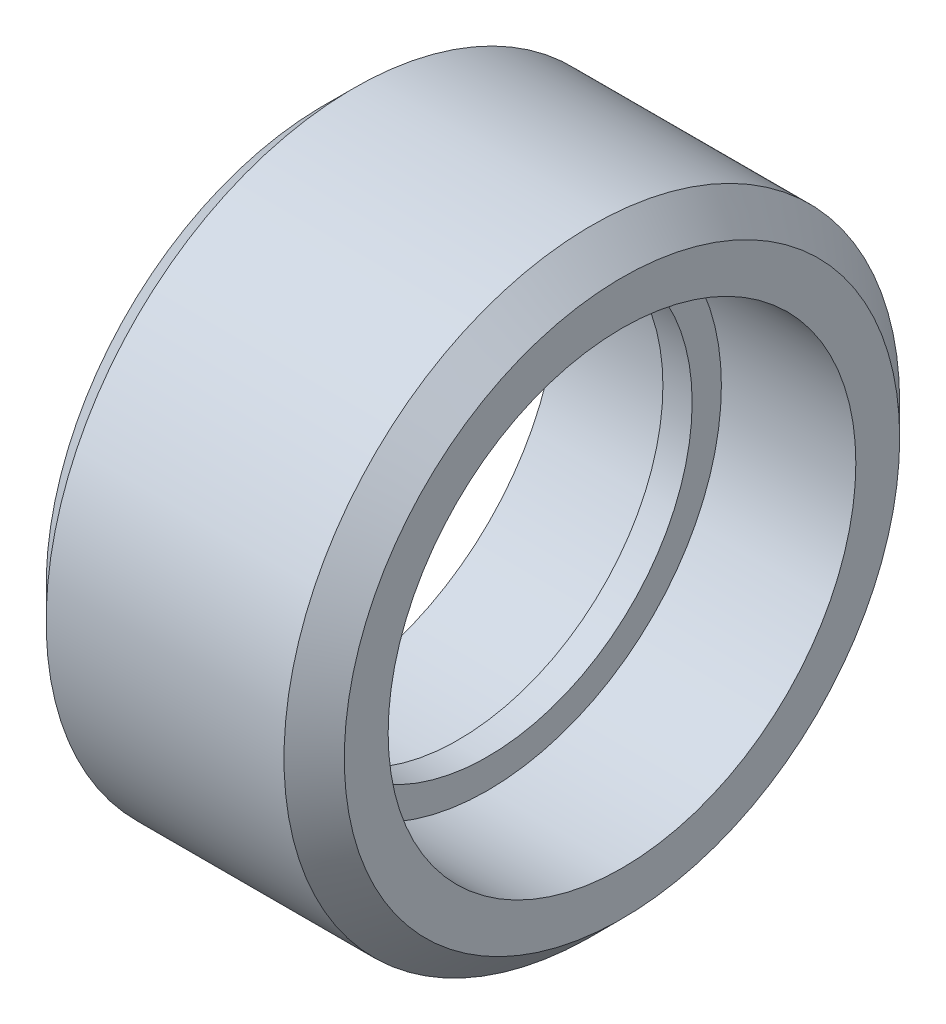
ISO-10303-21;
HEADER;
FILE_DESCRIPTION(('STEP AP214'),'2;1');
FILE_NAME('part.step','',(''),(''),'','','');
FILE_SCHEMA(('AUTOMOTIVE_DESIGN { 1 0 10303 214 1 1 1 1 }'));
ENDSEC;
DATA;
#1=APPLICATION_CONTEXT('core data for automotive mechanical design processes');
#2=APPLICATION_PROTOCOL_DEFINITION('international standard','automotive_design',2000,#1);
#3=PRODUCT_CONTEXT('',#1,'mechanical');
#4=PRODUCT('Part','Part','',(#3));
#5=PRODUCT_RELATED_PRODUCT_CATEGORY('part','',(#4));
#6=PRODUCT_DEFINITION_FORMATION('','',#4);
#7=PRODUCT_DEFINITION_CONTEXT('part definition',#1,'design');
#8=PRODUCT_DEFINITION('design','',#6,#7);
#9=PRODUCT_DEFINITION_SHAPE('','',#8);
#10=(LENGTH_UNIT() NAMED_UNIT(*) SI_UNIT(.MILLI.,.METRE.));
#11=(NAMED_UNIT(*) PLANE_ANGLE_UNIT() SI_UNIT($,.RADIAN.));
#12=(NAMED_UNIT(*) SI_UNIT($,.STERADIAN.) SOLID_ANGLE_UNIT());
#13=UNCERTAINTY_MEASURE_WITH_UNIT(LENGTH_MEASURE(1.E-05),#10,'distance_accuracy_value','');
#14=(GEOMETRIC_REPRESENTATION_CONTEXT(3) GLOBAL_UNCERTAINTY_ASSIGNED_CONTEXT((#13)) GLOBAL_UNIT_ASSIGNED_CONTEXT((#10,
#11,#12)) REPRESENTATION_CONTEXT('',''));
#15=CARTESIAN_POINT('',(0.,0.,0.));
#16=DIRECTION('',(0.,0.,1.));
#17=DIRECTION('',(1.,0.,0.));
#18=AXIS2_PLACEMENT_3D('',#15,#16,#17);
#19=CARTESIAN_POINT('',(0.,0.,0.));
#20=DIRECTION('',(1.,0.,0.));
#21=DIRECTION('',(0.,0.,-1.));
#22=AXIS2_PLACEMENT_3D('',#19,#20,#21);
#23=CYLINDRICAL_SURFACE('',#22,7.);
#24=CARTESIAN_POINT('',(-0.5,0.,0.));
#25=DIRECTION('',(1.,0.,0.));
#26=DIRECTION('',(0.,0.,-1.));
#27=AXIS2_PLACEMENT_3D('',#24,#25,#26);
#28=CIRCLE('',#27,7.);
#29=CARTESIAN_POINT('',(-0.5,0.,-7.));
#30=VERTEX_POINT('',#29);
#31=EDGE_CURVE('E10',#30,#30,#28,.T.);
#32=ORIENTED_EDGE('',*,*,#31,.F.);
#33=EDGE_LOOP('',(#32));
#34=FACE_BOUND('',#33,.T.);
#35=CARTESIAN_POINT('',(0.5,0.,0.));
#36=DIRECTION('',(1.,0.,0.));
#37=DIRECTION('',(0.,0.,-1.));
#38=AXIS2_PLACEMENT_3D('',#35,#36,#37);
#39=CIRCLE('',#38,7.);
#40=CARTESIAN_POINT('',(0.5,0.,-7.));
#41=VERTEX_POINT('',#40);
#42=EDGE_CURVE('E52',#41,#41,#39,.T.);
#43=ORIENTED_EDGE('',*,*,#42,.T.);
#44=EDGE_LOOP('',(#43));
#45=FACE_BOUND('',#44,.T.);
#46=ADVANCED_FACE('F30',(#34,#45),#23,.F.);
#47=CARTESIAN_POINT('',(-0.5,7.,0.));
#48=DIRECTION('',(-1.,0.,0.));
#49=DIRECTION('',(0.,0.,1.));
#50=AXIS2_PLACEMENT_3D('',#47,#48,#49);
#51=PLANE('',#50);
#52=ORIENTED_EDGE('',*,*,#31,.T.);
#53=EDGE_LOOP('',(#52));
#54=FACE_BOUND('',#53,.T.);
#55=CARTESIAN_POINT('',(-0.5,0.,0.));
#56=DIRECTION('',(1.,0.,0.));
#57=DIRECTION('',(0.,0.,-1.));
#58=AXIS2_PLACEMENT_3D('',#55,#56,#57);
#59=CIRCLE('',#58,8.);
#60=CARTESIAN_POINT('',(-0.5,0.,-8.));
#61=VERTEX_POINT('',#60);
#62=EDGE_CURVE('E36',#61,#61,#59,.T.);
#63=ORIENTED_EDGE('',*,*,#62,.F.);
#64=EDGE_LOOP('',(#63));
#65=FACE_BOUND('',#64,.T.);
#66=ADVANCED_FACE('F87',(#54,#65),#51,.T.);
#67=CARTESIAN_POINT('',(0.,0.,0.));
#68=DIRECTION('',(1.,0.,0.));
#69=DIRECTION('',(0.,0.,-1.));
#70=AXIS2_PLACEMENT_3D('',#67,#68,#69);
#71=CYLINDRICAL_SURFACE('',#70,8.);
#72=ORIENTED_EDGE('',*,*,#62,.T.);
#73=EDGE_LOOP('',(#72));
#74=FACE_BOUND('',#73,.T.);
#75=CARTESIAN_POINT('',(-5.1,0.,0.));
#76=DIRECTION('',(1.,0.,0.));
#77=DIRECTION('',(0.,0.,-1.));
#78=AXIS2_PLACEMENT_3D('',#75,#76,#77);
#79=CIRCLE('',#78,8.);
#80=CARTESIAN_POINT('',(-5.1,0.,-8.));
#81=VERTEX_POINT('',#80);
#82=EDGE_CURVE('E40',#81,#81,#79,.T.);
#83=ORIENTED_EDGE('',*,*,#82,.F.);
#84=EDGE_LOOP('',(#83));
#85=FACE_BOUND('',#84,.T.);
#86=ADVANCED_FACE('F92',(#74,#85),#71,.F.);
#87=CARTESIAN_POINT('',(-5.1,8.,0.));
#88=DIRECTION('',(-1.,0.,0.));
#89=DIRECTION('',(0.,0.,1.));
#90=AXIS2_PLACEMENT_3D('',#87,#88,#89);
#91=PLANE('',#90);
#92=ORIENTED_EDGE('',*,*,#82,.T.);
#93=EDGE_LOOP('',(#92));
#94=FACE_BOUND('',#93,.T.);
#95=CARTESIAN_POINT('',(-5.1,0.,0.));
#96=DIRECTION('',(1.,0.,0.));
#97=DIRECTION('',(0.,0.,-1.));
#98=AXIS2_PLACEMENT_3D('',#95,#96,#97);
#99=CIRCLE('',#98,9.5);
#100=CARTESIAN_POINT('',(-5.1,0.,-9.5));
#101=VERTEX_POINT('',#100);
#102=EDGE_CURVE('E44',#101,#101,#99,.T.);
#103=ORIENTED_EDGE('',*,*,#102,.F.);
#104=EDGE_LOOP('',(#103));
#105=FACE_BOUND('',#104,.T.);
#106=ADVANCED_FACE('F83',(#94,#105),#91,.T.);
#107=CARTESIAN_POINT('',(-4.06862955768486,0.,0.));
#108=DIRECTION('',(1.,0.,0.));
#109=DIRECTION('',(0.,0.,-1.));
#110=AXIS2_PLACEMENT_3D('',#107,#108,#109);
#111=CONICAL_SURFACE('',#110,10.5313704423151,0.78539816339745);
#112=ORIENTED_EDGE('',*,*,#102,.T.);
#113=EDGE_LOOP('',(#112));
#114=FACE_BOUND('',#113,.T.);
#115=CARTESIAN_POINT('',(-4.06862955768486,0.,0.));
#116=DIRECTION('',(1.,0.,0.));
#117=DIRECTION('',(0.,0.,-1.));
#118=AXIS2_PLACEMENT_3D('',#115,#116,#117);
#119=CIRCLE('',#118,10.5313704423151);
#120=CARTESIAN_POINT('',(-4.06862955768486,0.,-10.5313704423151));
#121=VERTEX_POINT('',#120);
#122=EDGE_CURVE('E49',#121,#121,#119,.T.);
#123=ORIENTED_EDGE('',*,*,#122,.F.);
#124=EDGE_LOOP('',(#123));
#125=FACE_BOUND('',#124,.T.);
#126=ADVANCED_FACE('F73',(#114,#125),#111,.T.);
#127=CARTESIAN_POINT('',(0.,0.,0.));
#128=DIRECTION('',(1.,0.,0.));
#129=DIRECTION('',(0.,0.,-1.));
#130=AXIS2_PLACEMENT_3D('',#127,#128,#129);
#131=CYLINDRICAL_SURFACE('',#130,10.5313704423151);
#132=ORIENTED_EDGE('',*,*,#122,.T.);
#133=EDGE_LOOP('',(#132));
#134=FACE_BOUND('',#133,.T.);
#135=CARTESIAN_POINT('',(4.06862955768486,0.,0.));
#136=DIRECTION('',(1.,0.,0.));
#137=DIRECTION('',(0.,0.,-1.));
#138=AXIS2_PLACEMENT_3D('',#135,#136,#137);
#139=CIRCLE('',#138,10.5313704423151);
#140=CARTESIAN_POINT('',(4.06862955768486,0.,-10.5313704423151));
#141=VERTEX_POINT('',#140);
#142=EDGE_CURVE('E64',#141,#141,#139,.T.);
#143=ORIENTED_EDGE('',*,*,#142,.F.);
#144=EDGE_LOOP('',(#143));
#145=FACE_BOUND('',#144,.T.);
#146=ADVANCED_FACE('F70',(#134,#145),#131,.T.);
#147=CARTESIAN_POINT('',(0.5,7.,0.));
#148=DIRECTION('',(1.,0.,0.));
#149=DIRECTION('',(0.,0.,1.));
#150=AXIS2_PLACEMENT_3D('',#147,#148,#149);
#151=PLANE('',#150);
#152=ORIENTED_EDGE('',*,*,#42,.F.);
#153=EDGE_LOOP('',(#152));
#154=FACE_BOUND('',#153,.T.);
#155=CARTESIAN_POINT('',(0.5,0.,0.));
#156=DIRECTION('',(1.,0.,0.));
#157=DIRECTION('',(0.,0.,-1.));
#158=AXIS2_PLACEMENT_3D('',#155,#156,#157);
#159=CIRCLE('',#158,8.);
#160=CARTESIAN_POINT('',(0.5,0.,-8.));
#161=VERTEX_POINT('',#160);
#162=EDGE_CURVE('E55',#161,#161,#159,.T.);
#163=ORIENTED_EDGE('',*,*,#162,.T.);
#164=EDGE_LOOP('',(#163));
#165=FACE_BOUND('',#164,.T.);
#166=ADVANCED_FACE('F72',(#154,#165),#151,.T.);
#167=CARTESIAN_POINT('',(0.,0.,0.));
#168=DIRECTION('',(-1.,0.,0.));
#169=DIRECTION('',(0.,0.,-1.));
#170=AXIS2_PLACEMENT_3D('',#167,#168,#169);
#171=CYLINDRICAL_SURFACE('',#170,8.);
#172=ORIENTED_EDGE('',*,*,#162,.F.);
#173=EDGE_LOOP('',(#172));
#174=FACE_BOUND('',#173,.T.);
#175=CARTESIAN_POINT('',(5.1,0.,0.));
#176=DIRECTION('',(1.,0.,0.));
#177=DIRECTION('',(0.,0.,-1.));
#178=AXIS2_PLACEMENT_3D('',#175,#176,#177);
#179=CIRCLE('',#178,8.);
#180=CARTESIAN_POINT('',(5.1,0.,-8.));
#181=VERTEX_POINT('',#180);
#182=EDGE_CURVE('E58',#181,#181,#179,.T.);
#183=ORIENTED_EDGE('',*,*,#182,.T.);
#184=EDGE_LOOP('',(#183));
#185=FACE_BOUND('',#184,.T.);
#186=ADVANCED_FACE('F80',(#174,#185),#171,.F.);
#187=CARTESIAN_POINT('',(5.1,8.,0.));
#188=DIRECTION('',(1.,0.,0.));
#189=DIRECTION('',(0.,0.,1.));
#190=AXIS2_PLACEMENT_3D('',#187,#188,#189);
#191=PLANE('',#190);
#192=ORIENTED_EDGE('',*,*,#182,.F.);
#193=EDGE_LOOP('',(#192));
#194=FACE_BOUND('',#193,.T.);
#195=CARTESIAN_POINT('',(5.1,0.,0.));
#196=DIRECTION('',(1.,0.,0.));
#197=DIRECTION('',(0.,0.,-1.));
#198=AXIS2_PLACEMENT_3D('',#195,#196,#197);
#199=CIRCLE('',#198,9.5);
#200=CARTESIAN_POINT('',(5.1,0.,-9.5));
#201=VERTEX_POINT('',#200);
#202=EDGE_CURVE('E61',#201,#201,#199,.T.);
#203=ORIENTED_EDGE('',*,*,#202,.T.);
#204=EDGE_LOOP('',(#203));
#205=FACE_BOUND('',#204,.T.);
#206=ADVANCED_FACE('F100',(#194,#205),#191,.T.);
#207=CARTESIAN_POINT('',(4.06862955768486,0.,0.));
#208=DIRECTION('',(-1.,0.,0.));
#209=DIRECTION('',(0.,0.,-1.));
#210=AXIS2_PLACEMENT_3D('',#207,#208,#209);
#211=CONICAL_SURFACE('',#210,10.5313704423151,0.78539816339745);
#212=ORIENTED_EDGE('',*,*,#202,.F.);
#213=EDGE_LOOP('',(#212));
#214=FACE_BOUND('',#213,.T.);
#215=ORIENTED_EDGE('',*,*,#142,.T.);
#216=EDGE_LOOP('',(#215));
#217=FACE_BOUND('',#216,.T.);
#218=ADVANCED_FACE('F68',(#214,#217),#211,.T.);
#219=CLOSED_SHELL('',(#46,#66,#86,#106,#126,#146,#166,#186,#206,#218));
#220=MANIFOLD_SOLID_BREP('B2',#219);
#221=ADVANCED_BREP_SHAPE_REPRESENTATION('',(#18,#220),#14);
#222=SHAPE_DEFINITION_REPRESENTATION(#9,#221);
ENDSEC;
END-ISO-10303-21;
